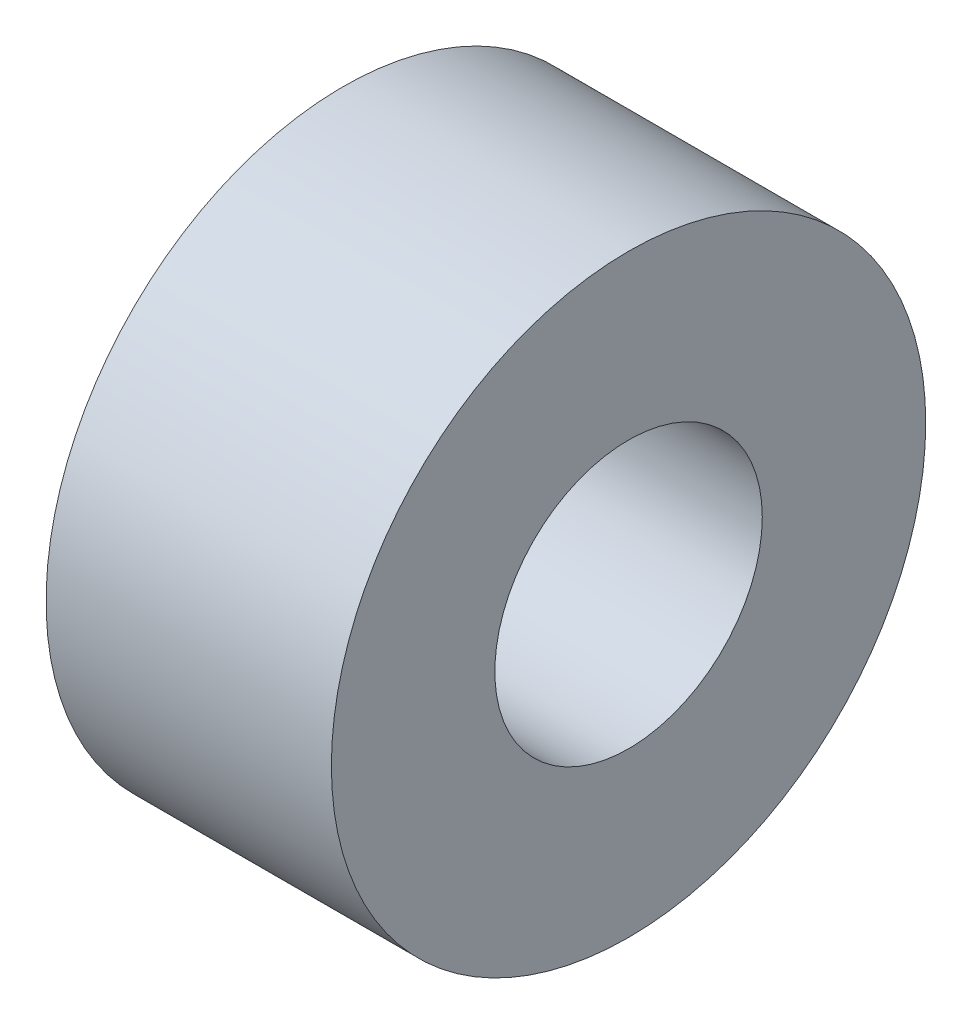
ISO-10303-21;
HEADER;
FILE_DESCRIPTION(('STEP AP214'),'2;1');
FILE_NAME('part.step','',(''),(''),'','','');
FILE_SCHEMA(('AUTOMOTIVE_DESIGN { 1 0 10303 214 1 1 1 1 }'));
ENDSEC;
DATA;
#1=APPLICATION_CONTEXT('core data for automotive mechanical design processes');
#2=APPLICATION_PROTOCOL_DEFINITION('international standard','automotive_design',2000,#1);
#3=PRODUCT_CONTEXT('',#1,'mechanical');
#4=PRODUCT('Part','Part','',(#3));
#5=PRODUCT_RELATED_PRODUCT_CATEGORY('part','',(#4));
#6=PRODUCT_DEFINITION_FORMATION('','',#4);
#7=PRODUCT_DEFINITION_CONTEXT('part definition',#1,'design');
#8=PRODUCT_DEFINITION('design','',#6,#7);
#9=PRODUCT_DEFINITION_SHAPE('','',#8);
#10=(LENGTH_UNIT() NAMED_UNIT(*) SI_UNIT(.MILLI.,.METRE.));
#11=(NAMED_UNIT(*) PLANE_ANGLE_UNIT() SI_UNIT($,.RADIAN.));
#12=(NAMED_UNIT(*) SI_UNIT($,.STERADIAN.) SOLID_ANGLE_UNIT());
#13=UNCERTAINTY_MEASURE_WITH_UNIT(LENGTH_MEASURE(1.E-05),#10,'distance_accuracy_value','');
#14=(GEOMETRIC_REPRESENTATION_CONTEXT(3) GLOBAL_UNCERTAINTY_ASSIGNED_CONTEXT((#13)) GLOBAL_UNIT_ASSIGNED_CONTEXT((#10,
#11,#12)) REPRESENTATION_CONTEXT('',''));
#15=CARTESIAN_POINT('',(0.,0.,0.));
#16=DIRECTION('',(0.,0.,1.));
#17=DIRECTION('',(1.,0.,0.));
#18=AXIS2_PLACEMENT_3D('',#15,#16,#17);
#19=CARTESIAN_POINT('',(2.4,0.,0.));
#20=DIRECTION('',(1.,0.,0.));
#21=DIRECTION('',(0.,0.,-1.));
#22=AXIS2_PLACEMENT_3D('',#19,#20,#21);
#23=PLANE('',#22);
#24=CARTESIAN_POINT('',(2.4,0.,0.));
#25=DIRECTION('',(1.,0.,0.));
#26=DIRECTION('',(0.,0.,-1.));
#27=AXIS2_PLACEMENT_3D('',#24,#25,#26);
#28=CIRCLE('',#27,2.25);
#29=CARTESIAN_POINT('',(2.4,0.,-2.25));
#30=VERTEX_POINT('',#29);
#31=EDGE_CURVE('E26',#30,#30,#28,.T.);
#32=ORIENTED_EDGE('',*,*,#31,.F.);
#33=EDGE_LOOP('',(#32));
#34=FACE_BOUND('',#33,.T.);
#35=CARTESIAN_POINT('',(2.4,0.,0.));
#36=DIRECTION('',(-1.,0.,0.));
#37=DIRECTION('',(0.,0.,1.));
#38=AXIS2_PLACEMENT_3D('',#35,#36,#37);
#39=CIRCLE('',#38,5.);
#40=CARTESIAN_POINT('',(2.4,0.,5.));
#41=VERTEX_POINT('',#40);
#42=EDGE_CURVE('E9',#41,#41,#39,.T.);
#43=ORIENTED_EDGE('',*,*,#42,.F.);
#44=EDGE_LOOP('',(#43));
#45=FACE_BOUND('',#44,.T.);
#46=ADVANCED_FACE('F14',(#34,#45),#23,.T.);
#47=CARTESIAN_POINT('',(-2.4,0.,0.));
#48=DIRECTION('',(-1.,0.,0.));
#49=DIRECTION('',(0.,0.,1.));
#50=AXIS2_PLACEMENT_3D('',#47,#48,#49);
#51=PLANE('',#50);
#52=CARTESIAN_POINT('',(-2.4,0.,0.));
#53=DIRECTION('',(-1.,0.,0.));
#54=DIRECTION('',(0.,0.,1.));
#55=AXIS2_PLACEMENT_3D('',#52,#53,#54);
#56=CIRCLE('',#55,2.25);
#57=CARTESIAN_POINT('',(-2.4,0.,2.25));
#58=VERTEX_POINT('',#57);
#59=EDGE_CURVE('E18',#58,#58,#56,.T.);
#60=ORIENTED_EDGE('',*,*,#59,.F.);
#61=EDGE_LOOP('',(#60));
#62=FACE_BOUND('',#61,.T.);
#63=CARTESIAN_POINT('',(-2.4,0.,0.));
#64=DIRECTION('',(1.,0.,0.));
#65=DIRECTION('',(0.,0.,-1.));
#66=AXIS2_PLACEMENT_3D('',#63,#64,#65);
#67=CIRCLE('',#66,5.);
#68=CARTESIAN_POINT('',(-2.4,0.,-5.));
#69=VERTEX_POINT('',#68);
#70=EDGE_CURVE('E22',#69,#69,#67,.T.);
#71=ORIENTED_EDGE('',*,*,#70,.F.);
#72=EDGE_LOOP('',(#71));
#73=FACE_BOUND('',#72,.T.);
#74=ADVANCED_FACE('F37',(#62,#73),#51,.T.);
#75=CARTESIAN_POINT('',(-2.4,0.,0.));
#76=DIRECTION('',(1.,0.,0.));
#77=DIRECTION('',(0.,0.,-1.));
#78=AXIS2_PLACEMENT_3D('',#75,#76,#77);
#79=CYLINDRICAL_SURFACE('',#78,5.);
#80=ORIENTED_EDGE('',*,*,#42,.T.);
#81=EDGE_LOOP('',(#80));
#82=FACE_BOUND('',#81,.T.);
#83=ORIENTED_EDGE('',*,*,#70,.T.);
#84=EDGE_LOOP('',(#83));
#85=FACE_BOUND('',#84,.T.);
#86=ADVANCED_FACE('F16',(#82,#85),#79,.T.);
#87=CARTESIAN_POINT('',(-2.7,0.,0.));
#88=DIRECTION('',(1.,0.,0.));
#89=DIRECTION('',(0.,0.,-1.));
#90=AXIS2_PLACEMENT_3D('',#87,#88,#89);
#91=CYLINDRICAL_SURFACE('',#90,2.25);
#92=ORIENTED_EDGE('',*,*,#31,.T.);
#93=EDGE_LOOP('',(#92));
#94=FACE_BOUND('',#93,.T.);
#95=ORIENTED_EDGE('',*,*,#59,.T.);
#96=EDGE_LOOP('',(#95));
#97=FACE_BOUND('',#96,.T.);
#98=ADVANCED_FACE('F35',(#94,#97),#91,.F.);
#99=CLOSED_SHELL('',(#46,#74,#86,#98));
#100=MANIFOLD_SOLID_BREP('B1',#99);
#101=ADVANCED_BREP_SHAPE_REPRESENTATION('',(#18,#100),#14);
#102=SHAPE_DEFINITION_REPRESENTATION(#9,#101);
ENDSEC;
END-ISO-10303-21;
